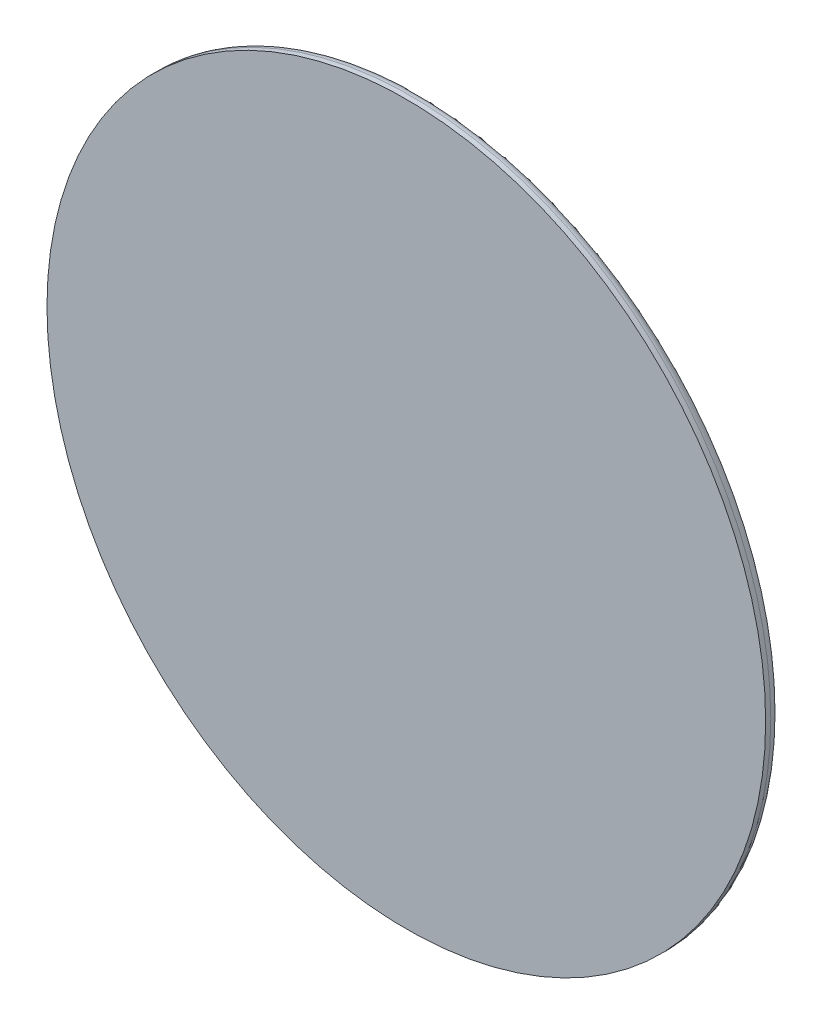
ISO-10303-21;
HEADER;
FILE_DESCRIPTION(('STEP AP214'),'2;1');
FILE_NAME('part.step','',(''),(''),'','','');
FILE_SCHEMA(('AUTOMOTIVE_DESIGN { 1 0 10303 214 1 1 1 1 }'));
ENDSEC;
DATA;
#1=APPLICATION_CONTEXT('core data for automotive mechanical design processes');
#2=APPLICATION_PROTOCOL_DEFINITION('international standard','automotive_design',2000,#1);
#3=PRODUCT_CONTEXT('',#1,'mechanical');
#4=PRODUCT('Part','Part','',(#3));
#5=PRODUCT_RELATED_PRODUCT_CATEGORY('part','',(#4));
#6=PRODUCT_DEFINITION_FORMATION('','',#4);
#7=PRODUCT_DEFINITION_CONTEXT('part definition',#1,'design');
#8=PRODUCT_DEFINITION('design','',#6,#7);
#9=PRODUCT_DEFINITION_SHAPE('','',#8);
#10=(LENGTH_UNIT() NAMED_UNIT(*) SI_UNIT(.MILLI.,.METRE.));
#11=(NAMED_UNIT(*) PLANE_ANGLE_UNIT() SI_UNIT($,.RADIAN.));
#12=(NAMED_UNIT(*) SI_UNIT($,.STERADIAN.) SOLID_ANGLE_UNIT());
#13=UNCERTAINTY_MEASURE_WITH_UNIT(LENGTH_MEASURE(1.E-05),#10,'distance_accuracy_value','');
#14=(GEOMETRIC_REPRESENTATION_CONTEXT(3) GLOBAL_UNCERTAINTY_ASSIGNED_CONTEXT((#13)) GLOBAL_UNIT_ASSIGNED_CONTEXT((#10,
#11,#12)) REPRESENTATION_CONTEXT('',''));
#15=CARTESIAN_POINT('',(0.,0.,0.));
#16=DIRECTION('',(0.,0.,1.));
#17=DIRECTION('',(1.,0.,0.));
#18=AXIS2_PLACEMENT_3D('',#15,#16,#17);
#19=CARTESIAN_POINT('',(-300.,0.,15.));
#20=DIRECTION('',(0.,0.,-1.));
#21=DIRECTION('',(-1.,0.,0.));
#22=AXIS2_PLACEMENT_3D('',#19,#20,#21);
#23=CYLINDRICAL_SURFACE('',#22,8.89000000000001);
#24=CARTESIAN_POINT('',(-300.,0.,10.));
#25=DIRECTION('',(0.,0.,1.));
#26=DIRECTION('',(1.,0.,0.));
#27=AXIS2_PLACEMENT_3D('',#24,#25,#26);
#28=CIRCLE('',#27,8.89000000000001);
#29=CARTESIAN_POINT('',(-291.11,0.,10.));
#30=VERTEX_POINT('',#29);
#31=EDGE_CURVE('E50',#30,#30,#28,.F.);
#32=ORIENTED_EDGE('',*,*,#31,.T.);
#33=EDGE_LOOP('',(#32));
#34=FACE_BOUND('',#33,.T.);
#35=CARTESIAN_POINT('',(-300.,0.,14.));
#36=DIRECTION('',(0.,0.,1.));
#37=DIRECTION('',(1.,0.,0.));
#38=AXIS2_PLACEMENT_3D('',#35,#36,#37);
#39=CIRCLE('',#38,8.89);
#40=CARTESIAN_POINT('',(-291.11,0.,14.));
#41=VERTEX_POINT('',#40);
#42=EDGE_CURVE('E84',#41,#41,#39,.T.);
#43=ORIENTED_EDGE('',*,*,#42,.T.);
#44=EDGE_LOOP('',(#43));
#45=FACE_BOUND('',#44,.T.);
#46=ADVANCED_FACE('F43',(#34,#45),#23,.F.);
#47=CARTESIAN_POINT('',(300.,0.,15.));
#48=DIRECTION('',(0.,0.,-1.));
#49=DIRECTION('',(-1.,0.,0.));
#50=AXIS2_PLACEMENT_3D('',#47,#48,#49);
#51=CYLINDRICAL_SURFACE('',#50,8.89000000000001);
#52=CARTESIAN_POINT('',(300.,0.,10.));
#53=DIRECTION('',(0.,0.,1.));
#54=DIRECTION('',(1.,0.,0.));
#55=AXIS2_PLACEMENT_3D('',#52,#53,#54);
#56=CIRCLE('',#55,8.89000000000001);
#57=CARTESIAN_POINT('',(308.89,0.,10.));
#58=VERTEX_POINT('',#57);
#59=EDGE_CURVE('E58',#58,#58,#56,.F.);
#60=ORIENTED_EDGE('',*,*,#59,.T.);
#61=EDGE_LOOP('',(#60));
#62=FACE_BOUND('',#61,.T.);
#63=CARTESIAN_POINT('',(300.,0.,14.));
#64=DIRECTION('',(0.,0.,1.));
#65=DIRECTION('',(1.,0.,0.));
#66=AXIS2_PLACEMENT_3D('',#63,#64,#65);
#67=CIRCLE('',#66,8.89000000000001);
#68=CARTESIAN_POINT('',(308.89,0.,14.));
#69=VERTEX_POINT('',#68);
#70=EDGE_CURVE('E81',#69,#69,#67,.T.);
#71=ORIENTED_EDGE('',*,*,#70,.T.);
#72=EDGE_LOOP('',(#71));
#73=FACE_BOUND('',#72,.T.);
#74=ADVANCED_FACE('F100',(#62,#73),#51,.F.);
#75=CARTESIAN_POINT('',(0.,300.,15.));
#76=DIRECTION('',(0.,0.,-1.));
#77=DIRECTION('',(-1.,0.,0.));
#78=AXIS2_PLACEMENT_3D('',#75,#76,#77);
#79=CYLINDRICAL_SURFACE('',#78,8.89);
#80=CARTESIAN_POINT('',(0.,300.,10.));
#81=DIRECTION('',(0.,0.,1.));
#82=DIRECTION('',(1.,0.,0.));
#83=AXIS2_PLACEMENT_3D('',#80,#81,#82);
#84=CIRCLE('',#83,8.89);
#85=CARTESIAN_POINT('',(8.89,300.,10.));
#86=VERTEX_POINT('',#85);
#87=EDGE_CURVE('E54',#86,#86,#84,.F.);
#88=ORIENTED_EDGE('',*,*,#87,.T.);
#89=EDGE_LOOP('',(#88));
#90=FACE_BOUND('',#89,.T.);
#91=CARTESIAN_POINT('',(0.,300.,14.));
#92=DIRECTION('',(0.,0.,1.));
#93=DIRECTION('',(1.,0.,0.));
#94=AXIS2_PLACEMENT_3D('',#91,#92,#93);
#95=CIRCLE('',#94,8.89);
#96=CARTESIAN_POINT('',(8.89,300.,14.));
#97=VERTEX_POINT('',#96);
#98=EDGE_CURVE('E78',#97,#97,#95,.T.);
#99=ORIENTED_EDGE('',*,*,#98,.T.);
#100=EDGE_LOOP('',(#99));
#101=FACE_BOUND('',#100,.T.);
#102=ADVANCED_FACE('F105',(#90,#101),#79,.F.);
#103=CARTESIAN_POINT('',(0.,0.,15.));
#104=DIRECTION('',(0.,0.,-1.));
#105=DIRECTION('',(-1.,0.,0.));
#106=AXIS2_PLACEMENT_3D('',#103,#104,#105);
#107=CYLINDRICAL_SURFACE('',#106,350.);
#108=CARTESIAN_POINT('',(0.,0.,10.));
#109=DIRECTION('',(0.,0.,1.));
#110=DIRECTION('',(1.,0.,0.));
#111=AXIS2_PLACEMENT_3D('',#108,#109,#110);
#112=CIRCLE('',#111,350.);
#113=CARTESIAN_POINT('',(350.,0.,10.));
#114=VERTEX_POINT('',#113);
#115=EDGE_CURVE('E10',#114,#114,#112,.T.);
#116=ORIENTED_EDGE('',*,*,#115,.T.);
#117=EDGE_LOOP('',(#116));
#118=FACE_BOUND('',#117,.T.);
#119=CARTESIAN_POINT('',(0.,0.,15.));
#120=DIRECTION('',(0.,0.,1.));
#121=DIRECTION('',(1.,0.,0.));
#122=AXIS2_PLACEMENT_3D('',#119,#120,#121);
#123=CIRCLE('',#122,350.);
#124=CARTESIAN_POINT('',(350.,0.,15.));
#125=VERTEX_POINT('',#124);
#126=EDGE_CURVE('E75',#125,#125,#123,.T.);
#127=ORIENTED_EDGE('',*,*,#126,.F.);
#128=EDGE_LOOP('',(#127));
#129=FACE_BOUND('',#128,.T.);
#130=ADVANCED_FACE('F110',(#118,#129),#107,.T.);
#131=CARTESIAN_POINT('',(0.,0.,15.));
#132=DIRECTION('',(0.,0.,1.));
#133=DIRECTION('',(1.,0.,0.));
#134=AXIS2_PLACEMENT_3D('',#131,#132,#133);
#135=PLANE('',#134);
#136=ORIENTED_EDGE('',*,*,#126,.T.);
#137=EDGE_LOOP('',(#136));
#138=FACE_BOUND('',#137,.T.);
#139=ADVANCED_FACE('F113',(#138),#135,.T.);
#140=CARTESIAN_POINT('',(0.,0.,0.));
#141=DIRECTION('',(0.,0.,1.));
#142=DIRECTION('',(1.,0.,0.));
#143=AXIS2_PLACEMENT_3D('',#140,#141,#142);
#144=PLANE('',#143);
#145=CARTESIAN_POINT('',(300.,0.,0.));
#146=DIRECTION('',(0.,0.,1.));
#147=DIRECTION('',(1.,0.,0.));
#148=AXIS2_PLACEMENT_3D('',#145,#146,#147);
#149=CIRCLE('',#148,18.89);
#150=CARTESIAN_POINT('',(318.89,0.,0.));
#151=VERTEX_POINT('',#150);
#152=EDGE_CURVE('E63',#151,#151,#149,.T.);
#153=ORIENTED_EDGE('',*,*,#152,.T.);
#154=EDGE_LOOP('',(#153));
#155=FACE_BOUND('',#154,.T.);
#156=CARTESIAN_POINT('',(0.,300.,0.));
#157=DIRECTION('',(0.,0.,1.));
#158=DIRECTION('',(1.,0.,0.));
#159=AXIS2_PLACEMENT_3D('',#156,#157,#158);
#160=CIRCLE('',#159,18.89);
#161=CARTESIAN_POINT('',(18.89,300.,0.));
#162=VERTEX_POINT('',#161);
#163=EDGE_CURVE('E66',#162,#162,#160,.T.);
#164=ORIENTED_EDGE('',*,*,#163,.T.);
#165=EDGE_LOOP('',(#164));
#166=FACE_BOUND('',#165,.T.);
#167=CARTESIAN_POINT('',(-300.,0.,0.));
#168=DIRECTION('',(0.,0.,1.));
#169=DIRECTION('',(1.,0.,0.));
#170=AXIS2_PLACEMENT_3D('',#167,#168,#169);
#171=CIRCLE('',#170,18.89);
#172=CARTESIAN_POINT('',(-281.11,0.,0.));
#173=VERTEX_POINT('',#172);
#174=EDGE_CURVE('E69',#173,#173,#171,.T.);
#175=ORIENTED_EDGE('',*,*,#174,.T.);
#176=EDGE_LOOP('',(#175));
#177=FACE_BOUND('',#176,.T.);
#178=CARTESIAN_POINT('',(0.,0.,0.));
#179=DIRECTION('',(0.,0.,1.));
#180=DIRECTION('',(1.,0.,0.));
#181=AXIS2_PLACEMENT_3D('',#178,#179,#180);
#182=CIRCLE('',#181,340.);
#183=CARTESIAN_POINT('',(340.,0.,0.));
#184=VERTEX_POINT('',#183);
#185=EDGE_CURVE('E72',#184,#184,#182,.F.);
#186=ORIENTED_EDGE('',*,*,#185,.T.);
#187=EDGE_LOOP('',(#186));
#188=FACE_BOUND('',#187,.T.);
#189=ADVANCED_FACE('F118',(#155,#166,#177,#188),#144,.F.);
#190=CARTESIAN_POINT('',(300.,0.,10.));
#191=DIRECTION('',(0.,0.,1.));
#192=DIRECTION('',(1.,0.,0.));
#193=AXIS2_PLACEMENT_3D('',#190,#191,#192);
#194=TOROIDAL_SURFACE('',#193,18.89,10.);
#195=ORIENTED_EDGE('',*,*,#59,.F.);
#196=EDGE_LOOP('',(#195));
#197=FACE_BOUND('',#196,.T.);
#198=ORIENTED_EDGE('',*,*,#152,.F.);
#199=EDGE_LOOP('',(#198));
#200=FACE_BOUND('',#199,.T.);
#201=ADVANCED_FACE('F114',(#197,#200),#194,.T.);
#202=CARTESIAN_POINT('',(0.,300.,10.));
#203=DIRECTION('',(0.,0.,1.));
#204=DIRECTION('',(1.,0.,0.));
#205=AXIS2_PLACEMENT_3D('',#202,#203,#204);
#206=TOROIDAL_SURFACE('',#205,18.89,10.);
#207=ORIENTED_EDGE('',*,*,#87,.F.);
#208=EDGE_LOOP('',(#207));
#209=FACE_BOUND('',#208,.T.);
#210=ORIENTED_EDGE('',*,*,#163,.F.);
#211=EDGE_LOOP('',(#210));
#212=FACE_BOUND('',#211,.T.);
#213=ADVANCED_FACE('F117',(#209,#212),#206,.T.);
#214=CARTESIAN_POINT('',(-300.,0.,10.));
#215=DIRECTION('',(0.,0.,1.));
#216=DIRECTION('',(1.,0.,0.));
#217=AXIS2_PLACEMENT_3D('',#214,#215,#216);
#218=TOROIDAL_SURFACE('',#217,18.89,10.);
#219=ORIENTED_EDGE('',*,*,#31,.F.);
#220=EDGE_LOOP('',(#219));
#221=FACE_BOUND('',#220,.T.);
#222=ORIENTED_EDGE('',*,*,#174,.F.);
#223=EDGE_LOOP('',(#222));
#224=FACE_BOUND('',#223,.T.);
#225=ADVANCED_FACE('F121',(#221,#224),#218,.T.);
#226=CARTESIAN_POINT('',(0.,0.,10.));
#227=DIRECTION('',(0.,0.,1.));
#228=DIRECTION('',(1.,0.,0.));
#229=AXIS2_PLACEMENT_3D('',#226,#227,#228);
#230=TOROIDAL_SURFACE('',#229,340.,10.);
#231=ORIENTED_EDGE('',*,*,#185,.F.);
#232=EDGE_LOOP('',(#231));
#233=FACE_BOUND('',#232,.T.);
#234=ORIENTED_EDGE('',*,*,#115,.F.);
#235=EDGE_LOOP('',(#234));
#236=FACE_BOUND('',#235,.T.);
#237=ADVANCED_FACE('F45',(#233,#236),#230,.T.);
#238=CARTESIAN_POINT('',(0.,300.,14.));
#239=DIRECTION('',(0.,0.,1.));
#240=DIRECTION('',(1.,0.,0.));
#241=AXIS2_PLACEMENT_3D('',#238,#239,#240);
#242=PLANE('',#241);
#243=ORIENTED_EDGE('',*,*,#98,.F.);
#244=EDGE_LOOP('',(#243));
#245=FACE_BOUND('',#244,.T.);
#246=ADVANCED_FACE('F96',(#245),#242,.F.);
#247=CARTESIAN_POINT('',(300.,0.,14.));
#248=DIRECTION('',(0.,0.,1.));
#249=DIRECTION('',(1.,0.,0.));
#250=AXIS2_PLACEMENT_3D('',#247,#248,#249);
#251=PLANE('',#250);
#252=ORIENTED_EDGE('',*,*,#70,.F.);
#253=EDGE_LOOP('',(#252));
#254=FACE_BOUND('',#253,.T.);
#255=ADVANCED_FACE('F91',(#254),#251,.F.);
#256=CARTESIAN_POINT('',(-300.,0.,14.));
#257=DIRECTION('',(0.,0.,1.));
#258=DIRECTION('',(1.,0.,0.));
#259=AXIS2_PLACEMENT_3D('',#256,#257,#258);
#260=PLANE('',#259);
#261=ORIENTED_EDGE('',*,*,#42,.F.);
#262=EDGE_LOOP('',(#261));
#263=FACE_BOUND('',#262,.T.);
#264=ADVANCED_FACE('F89',(#263),#260,.F.);
#265=CLOSED_SHELL('',(#46,#74,#102,#130,#139,#189,#201,#213,#225,#237,#246,#255,#264));
#266=MANIFOLD_SOLID_BREP('B2',#265);
#267=ADVANCED_BREP_SHAPE_REPRESENTATION('',(#18,#266),#14);
#268=SHAPE_DEFINITION_REPRESENTATION(#9,#267);
ENDSEC;
END-ISO-10303-21;
